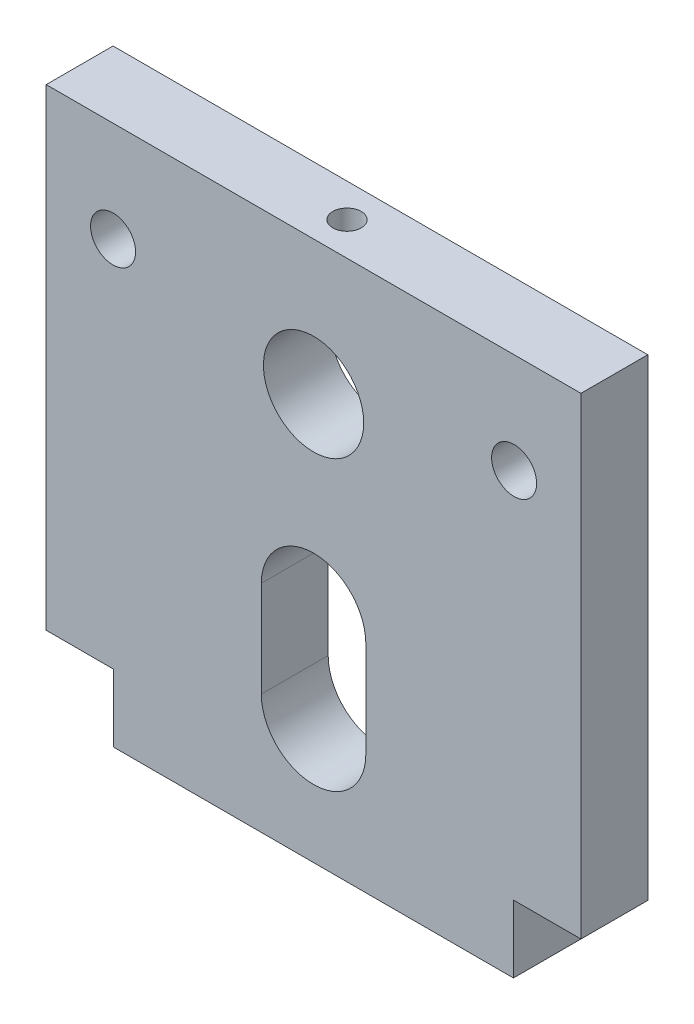
ISO-10303-21;
HEADER;
FILE_DESCRIPTION(('STEP AP214'),'2;1');
FILE_NAME('part.step','',(''),(''),'','','');
FILE_SCHEMA(('AUTOMOTIVE_DESIGN { 1 0 10303 214 1 1 1 1 }'));
ENDSEC;
DATA;
#1=APPLICATION_CONTEXT('core data for automotive mechanical design processes');
#2=APPLICATION_PROTOCOL_DEFINITION('international standard','automotive_design',2000,#1);
#3=PRODUCT_CONTEXT('',#1,'mechanical');
#4=PRODUCT('Part','Part','',(#3));
#5=PRODUCT_RELATED_PRODUCT_CATEGORY('part','',(#4));
#6=PRODUCT_DEFINITION_FORMATION('','',#4);
#7=PRODUCT_DEFINITION_CONTEXT('part definition',#1,'design');
#8=PRODUCT_DEFINITION('design','',#6,#7);
#9=PRODUCT_DEFINITION_SHAPE('','',#8);
#10=(LENGTH_UNIT() NAMED_UNIT(*) SI_UNIT(.MILLI.,.METRE.));
#11=(NAMED_UNIT(*) PLANE_ANGLE_UNIT() SI_UNIT($,.RADIAN.));
#12=(NAMED_UNIT(*) SI_UNIT($,.STERADIAN.) SOLID_ANGLE_UNIT());
#13=UNCERTAINTY_MEASURE_WITH_UNIT(LENGTH_MEASURE(1.E-05),#10,'distance_accuracy_value','');
#14=(GEOMETRIC_REPRESENTATION_CONTEXT(3) GLOBAL_UNCERTAINTY_ASSIGNED_CONTEXT((#13)) GLOBAL_UNIT_ASSIGNED_CONTEXT((#10,
#11,#12)) REPRESENTATION_CONTEXT('',''));
#15=CARTESIAN_POINT('',(0.,0.,0.));
#16=DIRECTION('',(0.,0.,1.));
#17=DIRECTION('',(1.,0.,0.));
#18=AXIS2_PLACEMENT_3D('',#15,#16,#17);
#19=CARTESIAN_POINT('',(0.,0.,6.35));
#20=DIRECTION('',(0.,0.,-1.));
#21=DIRECTION('',(-1.,0.,0.));
#22=AXIS2_PLACEMENT_3D('',#19,#20,#21);
#23=PLANE('',#22);
#24=DIRECTION('',(1.,0.,0.));
#25=VECTOR('',#24,1.);
#26=CARTESIAN_POINT('',(-25.6832529056942,38.8666430110286,6.35));
#27=LINE('',#26,#25);
#28=CARTESIAN_POINT('',(-25.6832529056942,38.8666430110286,6.35));
#29=VERTEX_POINT('',#28);
#30=CARTESIAN_POINT('',(25.1167470943058,38.8666430110286,6.35));
#31=VERTEX_POINT('',#30);
#32=EDGE_CURVE('E191',#29,#31,#27,.T.);
#33=ORIENTED_EDGE('',*,*,#32,.F.);
#34=DIRECTION('',(0.,1.,0.));
#35=VECTOR('',#34,1.);
#36=CARTESIAN_POINT('',(-25.6832529056942,-6.02785698897139,6.35));
#37=LINE('',#36,#35);
#38=CARTESIAN_POINT('',(-25.6832529056942,-6.02785698897139,6.35));
#39=VERTEX_POINT('',#38);
#40=EDGE_CURVE('E214',#39,#29,#37,.T.);
#41=ORIENTED_EDGE('',*,*,#40,.F.);
#42=DIRECTION('',(-1.,0.,0.));
#43=VECTOR('',#42,1.);
#44=CARTESIAN_POINT('',(-19.2697529056942,-6.02785698897138,6.35));
#45=LINE('',#44,#43);
#46=CARTESIAN_POINT('',(-19.2697529056942,-6.02785698897138,6.35));
#47=VERTEX_POINT('',#46);
#48=EDGE_CURVE('E215',#47,#39,#45,.T.);
#49=ORIENTED_EDGE('',*,*,#48,.F.);
#50=DIRECTION('',(0.,1.,0.));
#51=VECTOR('',#50,1.);
#52=CARTESIAN_POINT('',(-19.2697529056942,-12.4413569889714,6.35));
#53=LINE('',#52,#51);
#54=CARTESIAN_POINT('',(-19.2697529056942,-12.4413569889714,6.35));
#55=VERTEX_POINT('',#54);
#56=EDGE_CURVE('E207',#55,#47,#53,.T.);
#57=ORIENTED_EDGE('',*,*,#56,.F.);
#58=DIRECTION('',(-1.,0.,0.));
#59=VECTOR('',#58,1.);
#60=CARTESIAN_POINT('',(18.7032470943058,-12.4413569889714,6.35));
#61=LINE('',#60,#59);
#62=CARTESIAN_POINT('',(18.7032470943058,-12.4413569889714,6.35));
#63=VERTEX_POINT('',#62);
#64=EDGE_CURVE('E206',#63,#55,#61,.T.);
#65=ORIENTED_EDGE('',*,*,#64,.F.);
#66=DIRECTION('',(0.,-1.,0.));
#67=VECTOR('',#66,1.);
#68=CARTESIAN_POINT('',(18.7032470943058,-6.02785698897138,6.35));
#69=LINE('',#68,#67);
#70=CARTESIAN_POINT('',(18.7032470943058,-6.02785698897138,6.35));
#71=VERTEX_POINT('',#70);
#72=EDGE_CURVE('E201',#71,#63,#69,.T.);
#73=ORIENTED_EDGE('',*,*,#72,.F.);
#74=DIRECTION('',(-1.,0.,0.));
#75=VECTOR('',#74,1.);
#76=CARTESIAN_POINT('',(25.1167470943058,-6.02785698897138,6.35));
#77=LINE('',#76,#75);
#78=CARTESIAN_POINT('',(25.1167470943058,-6.02785698897138,6.35));
#79=VERTEX_POINT('',#78);
#80=EDGE_CURVE('E199',#79,#71,#77,.T.);
#81=ORIENTED_EDGE('',*,*,#80,.F.);
#82=DIRECTION('',(0.,-1.,0.));
#83=VECTOR('',#82,1.);
#84=CARTESIAN_POINT('',(25.1167470943058,38.8666430110286,6.35));
#85=LINE('',#84,#83);
#86=EDGE_CURVE('E198',#31,#79,#85,.T.);
#87=ORIENTED_EDGE('',*,*,#86,.F.);
#88=EDGE_LOOP('',(#33,#41,#49,#57,#65,#73,#81,#87));
#89=FACE_BOUND('',#88,.T.);
#90=CARTESIAN_POINT('',(-0.283252905694163,26.1031430110286,6.35));
#91=DIRECTION('',(0.,0.,1.));
#92=DIRECTION('',(1.,0.,0.));
#93=AXIS2_PLACEMENT_3D('',#90,#91,#92);
#94=CIRCLE('',#93,4.7625);
#95=CARTESIAN_POINT('',(4.47924709430584,26.1031430110286,6.35));
#96=VERTEX_POINT('',#95);
#97=EDGE_CURVE('E176',#96,#96,#94,.T.);
#98=ORIENTED_EDGE('',*,*,#97,.F.);
#99=EDGE_LOOP('',(#98));
#100=FACE_BOUND('',#99,.T.);
#101=CARTESIAN_POINT('',(18.7667470943058,29.3416430110286,6.35));
#102=DIRECTION('',(0.,0.,1.));
#103=DIRECTION('',(1.,0.,0.));
#104=AXIS2_PLACEMENT_3D('',#101,#102,#103);
#105=CIRCLE('',#104,2.13995);
#106=CARTESIAN_POINT('',(20.9066970943058,29.3416430110286,6.35));
#107=VERTEX_POINT('',#106);
#108=EDGE_CURVE('E185',#107,#107,#105,.T.);
#109=ORIENTED_EDGE('',*,*,#108,.F.);
#110=EDGE_LOOP('',(#109));
#111=FACE_BOUND('',#110,.T.);
#112=CARTESIAN_POINT('',(-19.3332529056942,29.3416430110286,6.35));
#113=DIRECTION('',(0.,0.,1.));
#114=DIRECTION('',(1.,0.,0.));
#115=AXIS2_PLACEMENT_3D('',#112,#113,#114);
#116=CIRCLE('',#115,2.13995);
#117=CARTESIAN_POINT('',(-17.1933029056942,29.3416430110286,6.35));
#118=VERTEX_POINT('',#117);
#119=EDGE_CURVE('E177',#118,#118,#116,.T.);
#120=ORIENTED_EDGE('',*,*,#119,.F.);
#121=EDGE_LOOP('',(#120));
#122=FACE_BOUND('',#121,.T.);
#123=DIRECTION('',(0.,-1.,0.));
#124=VECTOR('',#123,1.);
#125=CARTESIAN_POINT('',(4.67979741050235,8.06066108189071,6.35));
#126=LINE('',#125,#124);
#127=CARTESIAN_POINT('',(4.67979741050235,8.06066108189071,6.35));
#128=VERTEX_POINT('',#127);
#129=CARTESIAN_POINT('',(4.67979741050235,-1.05833895885947,6.35));
#130=VERTEX_POINT('',#129);
#131=EDGE_CURVE('E65',#128,#130,#126,.T.);
#132=ORIENTED_EDGE('',*,*,#131,.T.);
#133=CARTESIAN_POINT('',(-0.283252905694165,-1.05833895885947,6.35));
#134=DIRECTION('',(0.,0.,1.));
#135=DIRECTION('',(1.,0.,0.));
#136=AXIS2_PLACEMENT_3D('',#133,#134,#135);
#137=CIRCLE('',#136,4.96305031619651);
#138=CARTESIAN_POINT('',(-5.24630322189068,-1.05833895885947,6.35));
#139=VERTEX_POINT('',#138);
#140=EDGE_CURVE('E155',#139,#130,#137,.T.);
#141=ORIENTED_EDGE('',*,*,#140,.F.);
#142=DIRECTION('',(0.,-1.,0.));
#143=VECTOR('',#142,1.);
#144=CARTESIAN_POINT('',(-5.24630322189068,8.06066108189071,6.35));
#145=LINE('',#144,#143);
#146=CARTESIAN_POINT('',(-5.24630322189068,8.06066108189071,6.35));
#147=VERTEX_POINT('',#146);
#148=EDGE_CURVE('E167',#147,#139,#145,.T.);
#149=ORIENTED_EDGE('',*,*,#148,.F.);
#150=CARTESIAN_POINT('',(-0.283252905694165,8.06066108189071,6.35));
#151=DIRECTION('',(0.,0.,1.));
#152=DIRECTION('',(1.,0.,0.));
#153=AXIS2_PLACEMENT_3D('',#150,#151,#152);
#154=CIRCLE('',#153,4.96305031619651);
#155=EDGE_CURVE('E148',#128,#147,#154,.T.);
#156=ORIENTED_EDGE('',*,*,#155,.F.);
#157=EDGE_LOOP('',(#132,#141,#149,#156));
#158=FACE_BOUND('',#157,.T.);
#159=ADVANCED_FACE('F50',(#89,#100,#111,#122,#158),#23,.F.);
#160=CARTESIAN_POINT('',(0.,0.,0.));
#161=DIRECTION('',(0.,0.,-1.));
#162=DIRECTION('',(-1.,0.,0.));
#163=AXIS2_PLACEMENT_3D('',#160,#161,#162);
#164=PLANE('',#163);
#165=CARTESIAN_POINT('',(-19.3332529056942,29.3416430110286,0.));
#166=DIRECTION('',(0.,0.,1.));
#167=DIRECTION('',(1.,0.,0.));
#168=AXIS2_PLACEMENT_3D('',#165,#166,#167);
#169=CIRCLE('',#168,2.13995);
#170=CARTESIAN_POINT('',(-17.1933029056942,29.3416430110286,0.));
#171=VERTEX_POINT('',#170);
#172=EDGE_CURVE('E171',#171,#171,#169,.T.);
#173=ORIENTED_EDGE('',*,*,#172,.T.);
#174=EDGE_LOOP('',(#173));
#175=FACE_BOUND('',#174,.T.);
#176=CARTESIAN_POINT('',(18.7667470943058,29.3416430110286,0.));
#177=DIRECTION('',(0.,0.,1.));
#178=DIRECTION('',(1.,0.,0.));
#179=AXIS2_PLACEMENT_3D('',#176,#177,#178);
#180=CIRCLE('',#179,2.13995);
#181=CARTESIAN_POINT('',(20.9066970943058,29.3416430110286,0.));
#182=VERTEX_POINT('',#181);
#183=EDGE_CURVE('E153',#182,#182,#180,.T.);
#184=ORIENTED_EDGE('',*,*,#183,.T.);
#185=EDGE_LOOP('',(#184));
#186=FACE_BOUND('',#185,.T.);
#187=CARTESIAN_POINT('',(-0.283252905694163,26.1031430110286,0.));
#188=DIRECTION('',(0.,0.,1.));
#189=DIRECTION('',(1.,0.,0.));
#190=AXIS2_PLACEMENT_3D('',#187,#188,#189);
#191=CIRCLE('',#190,4.7625);
#192=CARTESIAN_POINT('',(4.47924709430584,26.1031430110286,0.));
#193=VERTEX_POINT('',#192);
#194=EDGE_CURVE('E189',#193,#193,#191,.T.);
#195=ORIENTED_EDGE('',*,*,#194,.T.);
#196=EDGE_LOOP('',(#195));
#197=FACE_BOUND('',#196,.T.);
#198=DIRECTION('',(1.,0.,0.));
#199=VECTOR('',#198,1.);
#200=CARTESIAN_POINT('',(-25.6832529056942,38.8666430110286,0.));
#201=LINE('',#200,#199);
#202=CARTESIAN_POINT('',(-25.6832529056942,38.8666430110286,0.));
#203=VERTEX_POINT('',#202);
#204=CARTESIAN_POINT('',(25.1167470943058,38.8666430110286,0.));
#205=VERTEX_POINT('',#204);
#206=EDGE_CURVE('E186',#203,#205,#201,.T.);
#207=ORIENTED_EDGE('',*,*,#206,.T.);
#208=DIRECTION('',(0.,-1.,0.));
#209=VECTOR('',#208,1.);
#210=CARTESIAN_POINT('',(25.1167470943058,38.8666430110286,0.));
#211=LINE('',#210,#209);
#212=CARTESIAN_POINT('',(25.1167470943058,-6.02785698897138,0.));
#213=VERTEX_POINT('',#212);
#214=EDGE_CURVE('E219',#205,#213,#211,.T.);
#215=ORIENTED_EDGE('',*,*,#214,.T.);
#216=DIRECTION('',(-1.,0.,0.));
#217=VECTOR('',#216,1.);
#218=CARTESIAN_POINT('',(25.1167470943058,-6.02785698897138,0.));
#219=LINE('',#218,#217);
#220=CARTESIAN_POINT('',(18.7032470943058,-6.02785698897138,0.));
#221=VERTEX_POINT('',#220);
#222=EDGE_CURVE('E224',#213,#221,#219,.T.);
#223=ORIENTED_EDGE('',*,*,#222,.T.);
#224=DIRECTION('',(0.,-1.,0.));
#225=VECTOR('',#224,1.);
#226=CARTESIAN_POINT('',(18.7032470943058,-6.02785698897138,0.));
#227=LINE('',#226,#225);
#228=CARTESIAN_POINT('',(18.7032470943058,-12.4413569889714,0.));
#229=VERTEX_POINT('',#228);
#230=EDGE_CURVE('E228',#221,#229,#227,.T.);
#231=ORIENTED_EDGE('',*,*,#230,.T.);
#232=DIRECTION('',(-1.,0.,0.));
#233=VECTOR('',#232,1.);
#234=CARTESIAN_POINT('',(18.7032470943058,-12.4413569889714,0.));
#235=LINE('',#234,#233);
#236=CARTESIAN_POINT('',(-19.2697529056942,-12.4413569889714,0.));
#237=VERTEX_POINT('',#236);
#238=EDGE_CURVE('E230',#229,#237,#235,.T.);
#239=ORIENTED_EDGE('',*,*,#238,.T.);
#240=DIRECTION('',(0.,1.,0.));
#241=VECTOR('',#240,1.);
#242=CARTESIAN_POINT('',(-19.2697529056942,-12.4413569889714,0.));
#243=LINE('',#242,#241);
#244=CARTESIAN_POINT('',(-19.2697529056942,-6.02785698897138,0.));
#245=VERTEX_POINT('',#244);
#246=EDGE_CURVE('E235',#237,#245,#243,.T.);
#247=ORIENTED_EDGE('',*,*,#246,.T.);
#248=DIRECTION('',(-1.,0.,0.));
#249=VECTOR('',#248,1.);
#250=CARTESIAN_POINT('',(-19.2697529056942,-6.02785698897138,0.));
#251=LINE('',#250,#249);
#252=CARTESIAN_POINT('',(-25.6832529056942,-6.02785698897139,0.));
#253=VERTEX_POINT('',#252);
#254=EDGE_CURVE('E234',#245,#253,#251,.T.);
#255=ORIENTED_EDGE('',*,*,#254,.T.);
#256=DIRECTION('',(0.,1.,0.));
#257=VECTOR('',#256,1.);
#258=CARTESIAN_POINT('',(-25.6832529056942,-6.02785698897139,0.));
#259=LINE('',#258,#257);
#260=EDGE_CURVE('E197',#253,#203,#259,.T.);
#261=ORIENTED_EDGE('',*,*,#260,.T.);
#262=EDGE_LOOP('',(#207,#215,#223,#231,#239,#247,#255,#261));
#263=FACE_BOUND('',#262,.T.);
#264=CARTESIAN_POINT('',(-0.283252905694165,-1.05833895885947,0.));
#265=DIRECTION('',(0.,0.,1.));
#266=DIRECTION('',(1.,0.,0.));
#267=AXIS2_PLACEMENT_3D('',#264,#265,#266);
#268=CIRCLE('',#267,4.96305031619651);
#269=CARTESIAN_POINT('',(-5.24630322189068,-1.05833895885947,0.));
#270=VERTEX_POINT('',#269);
#271=CARTESIAN_POINT('',(4.67979741050235,-1.05833895885947,0.));
#272=VERTEX_POINT('',#271);
#273=EDGE_CURVE('E144',#270,#272,#268,.T.);
#274=ORIENTED_EDGE('',*,*,#273,.T.);
#275=DIRECTION('',(0.,-1.,0.));
#276=VECTOR('',#275,1.);
#277=CARTESIAN_POINT('',(4.67979741050235,8.06066108189071,0.));
#278=LINE('',#277,#276);
#279=CARTESIAN_POINT('',(4.67979741050235,8.06066108189071,0.));
#280=VERTEX_POINT('',#279);
#281=EDGE_CURVE('E131',#280,#272,#278,.T.);
#282=ORIENTED_EDGE('',*,*,#281,.F.);
#283=CARTESIAN_POINT('',(-0.283252905694165,8.06066108189071,0.));
#284=DIRECTION('',(0.,0.,1.));
#285=DIRECTION('',(1.,0.,0.));
#286=AXIS2_PLACEMENT_3D('',#283,#284,#285);
#287=CIRCLE('',#286,4.96305031619651);
#288=CARTESIAN_POINT('',(-5.24630322189068,8.06066108189071,0.));
#289=VERTEX_POINT('',#288);
#290=EDGE_CURVE('E158',#280,#289,#287,.T.);
#291=ORIENTED_EDGE('',*,*,#290,.T.);
#292=DIRECTION('',(0.,-1.,0.));
#293=VECTOR('',#292,1.);
#294=CARTESIAN_POINT('',(-5.24630322189068,8.06066108189071,0.));
#295=LINE('',#294,#293);
#296=EDGE_CURVE('E75',#289,#270,#295,.T.);
#297=ORIENTED_EDGE('',*,*,#296,.T.);
#298=EDGE_LOOP('',(#274,#282,#291,#297));
#299=FACE_BOUND('',#298,.T.);
#300=ADVANCED_FACE('F156',(#175,#186,#197,#263,#299),#164,.T.);
#301=CARTESIAN_POINT('',(-25.6832529056942,38.8666430110286,6.35));
#302=DIRECTION('',(0.,1.,0.));
#303=DIRECTION('',(0.,0.,1.));
#304=AXIS2_PLACEMENT_3D('',#301,#302,#303);
#305=PLANE('',#304);
#306=CARTESIAN_POINT('',(-0.283252905694174,38.8666430110286,3.175));
#307=DIRECTION('',(0.,1.,0.));
#308=DIRECTION('',(0.,0.,1.));
#309=AXIS2_PLACEMENT_3D('',#306,#307,#308);
#310=CIRCLE('',#309,1.35255);
#311=CARTESIAN_POINT('',(-0.283252905694174,38.8666430110286,4.52755));
#312=VERTEX_POINT('',#311);
#313=EDGE_CURVE('E332',#312,#312,#310,.T.);
#314=ORIENTED_EDGE('',*,*,#313,.F.);
#315=EDGE_LOOP('',(#314));
#316=FACE_BOUND('',#315,.T.);
#317=ORIENTED_EDGE('',*,*,#206,.F.);
#318=DIRECTION('',(0.,0.,-1.));
#319=VECTOR('',#318,1.);
#320=CARTESIAN_POINT('',(-25.6832529056942,38.8666430110286,6.35));
#321=LINE('',#320,#319);
#322=EDGE_CURVE('E11',#29,#203,#321,.T.);
#323=ORIENTED_EDGE('',*,*,#322,.F.);
#324=ORIENTED_EDGE('',*,*,#32,.T.);
#325=DIRECTION('',(0.,0.,-1.));
#326=VECTOR('',#325,1.);
#327=CARTESIAN_POINT('',(25.1167470943058,38.8666430110286,6.35));
#328=LINE('',#327,#326);
#329=EDGE_CURVE('E51',#31,#205,#328,.T.);
#330=ORIENTED_EDGE('',*,*,#329,.T.);
#331=EDGE_LOOP('',(#317,#323,#324,#330));
#332=FACE_BOUND('',#331,.T.);
#333=ADVANCED_FACE('F47',(#316,#332),#305,.T.);
#334=CARTESIAN_POINT('',(-25.6832529056942,-6.02785698897139,6.35));
#335=DIRECTION('',(-1.,0.,0.));
#336=DIRECTION('',(0.,-1.,0.));
#337=AXIS2_PLACEMENT_3D('',#334,#335,#336);
#338=PLANE('',#337);
#339=ORIENTED_EDGE('',*,*,#260,.F.);
#340=DIRECTION('',(0.,0.,-1.));
#341=VECTOR('',#340,1.);
#342=CARTESIAN_POINT('',(-25.6832529056942,-6.02785698897139,6.35));
#343=LINE('',#342,#341);
#344=EDGE_CURVE('E57',#39,#253,#343,.T.);
#345=ORIENTED_EDGE('',*,*,#344,.F.);
#346=ORIENTED_EDGE('',*,*,#40,.T.);
#347=ORIENTED_EDGE('',*,*,#322,.T.);
#348=EDGE_LOOP('',(#339,#345,#346,#347));
#349=FACE_BOUND('',#348,.T.);
#350=ADVANCED_FACE('F261',(#349),#338,.T.);
#351=CARTESIAN_POINT('',(-19.2697529056942,-6.02785698897138,6.35));
#352=DIRECTION('',(0.,-1.,0.));
#353=DIRECTION('',(1.,0.,0.));
#354=AXIS2_PLACEMENT_3D('',#351,#352,#353);
#355=PLANE('',#354);
#356=ORIENTED_EDGE('',*,*,#254,.F.);
#357=DIRECTION('',(0.,0.,-1.));
#358=VECTOR('',#357,1.);
#359=CARTESIAN_POINT('',(-19.2697529056942,-6.02785698897138,6.35));
#360=LINE('',#359,#358);
#361=EDGE_CURVE('E243',#47,#245,#360,.T.);
#362=ORIENTED_EDGE('',*,*,#361,.F.);
#363=ORIENTED_EDGE('',*,*,#48,.T.);
#364=ORIENTED_EDGE('',*,*,#344,.T.);
#365=EDGE_LOOP('',(#356,#362,#363,#364));
#366=FACE_BOUND('',#365,.T.);
#367=ADVANCED_FACE('F284',(#366),#355,.T.);
#368=CARTESIAN_POINT('',(-19.2697529056942,-12.4413569889714,6.35));
#369=DIRECTION('',(-1.,0.,0.));
#370=DIRECTION('',(0.,-1.,0.));
#371=AXIS2_PLACEMENT_3D('',#368,#369,#370);
#372=PLANE('',#371);
#373=ORIENTED_EDGE('',*,*,#246,.F.);
#374=DIRECTION('',(0.,0.,-1.));
#375=VECTOR('',#374,1.);
#376=CARTESIAN_POINT('',(-19.2697529056942,-12.4413569889714,6.35));
#377=LINE('',#376,#375);
#378=EDGE_CURVE('E242',#55,#237,#377,.T.);
#379=ORIENTED_EDGE('',*,*,#378,.F.);
#380=ORIENTED_EDGE('',*,*,#56,.T.);
#381=ORIENTED_EDGE('',*,*,#361,.T.);
#382=EDGE_LOOP('',(#373,#379,#380,#381));
#383=FACE_BOUND('',#382,.T.);
#384=ADVANCED_FACE('F278',(#383),#372,.T.);
#385=CARTESIAN_POINT('',(18.7032470943058,-12.4413569889714,6.35));
#386=DIRECTION('',(0.,-1.,0.));
#387=DIRECTION('',(1.,0.,0.));
#388=AXIS2_PLACEMENT_3D('',#385,#386,#387);
#389=PLANE('',#388);
#390=ORIENTED_EDGE('',*,*,#238,.F.);
#391=DIRECTION('',(0.,0.,-1.));
#392=VECTOR('',#391,1.);
#393=CARTESIAN_POINT('',(18.7032470943058,-12.4413569889714,6.35));
#394=LINE('',#393,#392);
#395=EDGE_CURVE('E241',#63,#229,#394,.T.);
#396=ORIENTED_EDGE('',*,*,#395,.F.);
#397=ORIENTED_EDGE('',*,*,#64,.T.);
#398=ORIENTED_EDGE('',*,*,#378,.T.);
#399=EDGE_LOOP('',(#390,#396,#397,#398));
#400=FACE_BOUND('',#399,.T.);
#401=ADVANCED_FACE('F277',(#400),#389,.T.);
#402=CARTESIAN_POINT('',(18.7032470943058,-6.02785698897138,6.35));
#403=DIRECTION('',(1.,0.,0.));
#404=DIRECTION('',(0.,1.,0.));
#405=AXIS2_PLACEMENT_3D('',#402,#403,#404);
#406=PLANE('',#405);
#407=ORIENTED_EDGE('',*,*,#230,.F.);
#408=DIRECTION('',(0.,0.,-1.));
#409=VECTOR('',#408,1.);
#410=CARTESIAN_POINT('',(18.7032470943058,-6.02785698897138,6.35));
#411=LINE('',#410,#409);
#412=EDGE_CURVE('E250',#71,#221,#411,.T.);
#413=ORIENTED_EDGE('',*,*,#412,.F.);
#414=ORIENTED_EDGE('',*,*,#72,.T.);
#415=ORIENTED_EDGE('',*,*,#395,.T.);
#416=EDGE_LOOP('',(#407,#413,#414,#415));
#417=FACE_BOUND('',#416,.T.);
#418=ADVANCED_FACE('F273',(#417),#406,.T.);
#419=CARTESIAN_POINT('',(25.1167470943058,-6.02785698897138,6.35));
#420=DIRECTION('',(0.,-1.,0.));
#421=DIRECTION('',(1.,0.,0.));
#422=AXIS2_PLACEMENT_3D('',#419,#420,#421);
#423=PLANE('',#422);
#424=ORIENTED_EDGE('',*,*,#222,.F.);
#425=DIRECTION('',(0.,0.,-1.));
#426=VECTOR('',#425,1.);
#427=CARTESIAN_POINT('',(25.1167470943058,-6.02785698897138,6.35));
#428=LINE('',#427,#426);
#429=EDGE_CURVE('E246',#79,#213,#428,.T.);
#430=ORIENTED_EDGE('',*,*,#429,.F.);
#431=ORIENTED_EDGE('',*,*,#80,.T.);
#432=ORIENTED_EDGE('',*,*,#412,.T.);
#433=EDGE_LOOP('',(#424,#430,#431,#432));
#434=FACE_BOUND('',#433,.T.);
#435=ADVANCED_FACE('F269',(#434),#423,.T.);
#436=CARTESIAN_POINT('',(25.1167470943058,38.8666430110286,6.35));
#437=DIRECTION('',(1.,0.,0.));
#438=DIRECTION('',(0.,1.,0.));
#439=AXIS2_PLACEMENT_3D('',#436,#437,#438);
#440=PLANE('',#439);
#441=ORIENTED_EDGE('',*,*,#214,.F.);
#442=ORIENTED_EDGE('',*,*,#329,.F.);
#443=ORIENTED_EDGE('',*,*,#86,.T.);
#444=ORIENTED_EDGE('',*,*,#429,.T.);
#445=EDGE_LOOP('',(#441,#442,#443,#444));
#446=FACE_BOUND('',#445,.T.);
#447=ADVANCED_FACE('F258',(#446),#440,.T.);
#448=CARTESIAN_POINT('',(-0.283252905694163,26.1031430110286,0.));
#449=DIRECTION('',(0.,0.,1.));
#450=DIRECTION('',(1.,0.,0.));
#451=AXIS2_PLACEMENT_3D('',#448,#449,#450);
#452=CYLINDRICAL_SURFACE('',#451,4.7625);
#453=CARTESIAN_POINT('',(-0.283252905694174,30.8656430110286,4.52755));
#454=CARTESIAN_POINT('',(-0.208874405736026,30.8656421015908,4.5275486430201));
#455=CARTESIAN_POINT('',(-0.134481908330508,30.863883695177,4.52139427786597));
#456=CARTESIAN_POINT('',(0.0121481427492365,30.8570403231636,4.49699047829311));
#457=CARTESIAN_POINT('',(0.0843848492039293,30.851954067271,4.47873635244937));
#458=CARTESIAN_POINT('',(0.224566466768027,30.8390143330927,4.43078329715905));
#459=CARTESIAN_POINT('',(0.292517169479274,30.8311646876722,4.40110021454008));
#460=CARTESIAN_POINT('',(0.422476658401505,30.8135207578096,4.33119378181307));
#461=CARTESIAN_POINT('',(0.484484842391155,30.8037262765841,4.29096936497405));
#462=CARTESIAN_POINT('',(0.602411605554832,30.7829588881212,4.20001870977713));
#463=CARTESIAN_POINT('',(0.658153709045761,30.7719637667209,4.14906872941423));
#464=CARTESIAN_POINT('',(0.760428283368972,30.7501717288703,4.03859076612216));
#465=CARTESIAN_POINT('',(0.806959392203056,30.7393748419459,3.97906151685142));
#466=CARTESIAN_POINT('',(0.890385838075102,30.7189706483605,3.85166351744424));
#467=CARTESIAN_POINT('',(0.927071910302048,30.709391161236,3.78365286087309));
#468=CARTESIAN_POINT('',(0.988416582063241,30.692835774221,3.64211211694877));
#469=CARTESIAN_POINT('',(1.01307773429582,30.6858593218219,3.56858320486075));
#470=CARTESIAN_POINT('',(1.04904771634093,30.6755303446948,3.42006189795207));
#471=CARTESIAN_POINT('',(1.06067929792737,30.6720904046822,3.34515390446938));
#472=CARTESIAN_POINT('',(1.07126705848638,30.6689633154032,3.1943768560357));
#473=CARTESIAN_POINT('',(1.07022595527154,30.6692753614771,3.11850801063768));
#474=CARTESIAN_POINT('',(1.05575274236854,30.6735391329063,2.97053442802031));
#475=CARTESIAN_POINT('',(1.04271802353279,30.6773741240544,2.89838691263082));
#476=CARTESIAN_POINT('',(1.005266881567,30.6880637858551,2.75734778962324));
#477=CARTESIAN_POINT('',(0.980849440525733,30.6949187265667,2.688456473801));
#478=CARTESIAN_POINT('',(0.921018110199574,30.7109736980892,2.55488196332034));
#479=CARTESIAN_POINT('',(0.885470231874481,30.7202020444125,2.49026233362383));
#480=CARTESIAN_POINT('',(0.804480374330773,30.739949625836,2.36776901838411));
#481=CARTESIAN_POINT('',(0.759036215692947,30.7504691450632,2.30989682311937));
#482=CARTESIAN_POINT('',(0.657541351273729,30.7720934119198,2.20027881637208));
#483=CARTESIAN_POINT('',(0.601158870924395,30.7832053700219,2.14884113440109));
#484=CARTESIAN_POINT('',(0.480430601140097,30.8044135496946,2.056083587976));
#485=CARTESIAN_POINT('',(0.416084409021523,30.8145097198553,2.01476423546827));
#486=CARTESIAN_POINT('',(0.280736315681626,30.8326253706565,1.94325494809201));
#487=CARTESIAN_POINT('',(0.209699932562487,30.8406331895481,1.91312712835502));
#488=CARTESIAN_POINT('',(0.0632896696307047,30.8535858242615,1.86533374841148));
#489=CARTESIAN_POINT('',(-0.0120831253918858,30.8585314025188,1.8476650859767));
#490=CARTESIAN_POINT('',(-0.162402208789636,30.8646843257905,1.8257900941737));
#491=CARTESIAN_POINT('',(-0.237282974890373,30.866007764691,1.82116553193465));
#492=CARTESIAN_POINT('',(-0.386752472094515,30.8651045204259,1.82434628148552));
#493=CARTESIAN_POINT('',(-0.461341236734929,30.862878257703,1.8321501211997));
#494=CARTESIAN_POINT('',(-0.60657323886549,30.8552012995763,1.85962538244712));
#495=CARTESIAN_POINT('',(-0.677265426245001,30.8498155565651,1.8790578995256));
#496=CARTESIAN_POINT('',(-0.814375401586083,30.8364361934415,1.92895641763358));
#497=CARTESIAN_POINT('',(-0.880792696760375,30.8284422733143,1.95942368801874));
#498=CARTESIAN_POINT('',(-1.00904917584107,30.8104684486735,2.03126494247286));
#499=CARTESIAN_POINT('',(-1.07075948415866,30.8004495970872,2.07285900781803));
#500=CARTESIAN_POINT('',(-1.18646918295864,30.7795806730468,2.16550128896996));
#501=CARTESIAN_POINT('',(-1.2404668357056,30.768730414112,2.21655162943405));
#502=CARTESIAN_POINT('',(-1.34102181537657,30.7469848128855,2.32861713337727));
#503=CARTESIAN_POINT('',(-1.38728260674078,30.736099327037,2.38990082578654));
#504=CARTESIAN_POINT('',(-1.46887734196172,30.7158942900598,2.51959581025901));
#505=CARTESIAN_POINT('',(-1.50421167494599,30.7065746831704,2.58800684837768));
#506=CARTESIAN_POINT('',(-1.5626915554602,30.6906654628349,2.72972431512764));
#507=CARTESIAN_POINT('',(-1.58590242939607,30.6840612595326,2.80300205720859));
#508=CARTESIAN_POINT('',(-1.61960122640761,30.6743455771231,2.95264418491539));
#509=CARTESIAN_POINT('',(-1.63009294717261,30.6712330554891,3.02900764216698));
#510=CARTESIAN_POINT('',(-1.63781639938448,30.6689483068662,3.17959566461426));
#511=CARTESIAN_POINT('',(-1.63552802559694,30.6696334687527,3.25379379693445));
#512=CARTESIAN_POINT('',(-1.61888582236865,30.674528423122,3.40069987613526));
#513=CARTESIAN_POINT('',(-1.60453238655974,30.6787381006148,3.47340787155346));
#514=CARTESIAN_POINT('',(-1.56446228763825,30.6901172593615,3.61457466494029));
#515=CARTESIAN_POINT('',(-1.53886016398553,30.6972568596062,3.68306855721659));
#516=CARTESIAN_POINT('',(-1.47710802331352,30.7136888015577,3.81484262392983));
#517=CARTESIAN_POINT('',(-1.44095615822818,30.7229815203814,3.87812188239307));
#518=CARTESIAN_POINT('',(-1.35773063181675,30.7430558307057,3.9999291052839));
#519=CARTESIAN_POINT('',(-1.31033571660894,30.7538764561547,4.05823115248443));
#520=CARTESIAN_POINT('',(-1.20656377936464,30.7755844260417,4.1662102271965));
#521=CARTESIAN_POINT('',(-1.15018450652386,30.7864717865395,4.21588508684919));
#522=CARTESIAN_POINT('',(-1.02832800896819,30.8074157125441,4.30644175885675));
#523=CARTESIAN_POINT('',(-0.962657022380482,30.8174443626607,4.34706990505124));
#524=CARTESIAN_POINT('',(-0.825132154228833,30.8352214929742,4.41664775838159));
#525=CARTESIAN_POINT('',(-0.753281733986893,30.8429712390535,4.44560395236433));
#526=CARTESIAN_POINT('',(-0.615435359077656,30.8544780413436,4.48782989682263));
#527=CARTESIAN_POINT('',(-0.549954950188781,30.8586323687404,4.50268750874605));
#528=CARTESIAN_POINT('',(-0.417404319195111,30.8642150861984,4.52254753056349));
#529=CARTESIAN_POINT('',(-0.350334305275061,30.8656438312436,4.52755122384977));
#530=CARTESIAN_POINT('',(-0.283252905694174,30.8656430110286,4.52755));
#531=B_SPLINE_CURVE_WITH_KNOTS('',3,(#453,#454,#455,#456,#457,#458,#459,#460,#461,#462,#463,
#464,#465,#466,#467,#468,#469,#470,#471,#472,#473,#474,#475,#476,#477,#478,#479,#480,#481,#482,
#483,#484,#485,#486,#487,#488,#489,#490,#491,#492,#493,#494,#495,#496,#497,#498,#499,#500,#501,
#502,#503,#504,#505,#506,#507,#508,#509,#510,#511,#512,#513,#514,#515,#516,#517,#518,#519,#520,
#521,#522,#523,#524,#525,#526,#527,#528,#529,#530),.UNSPECIFIED.,.T.,.F.,(4,2,2,2,2,2,2,2,2,2,2,
2,2,2,2,2,2,2,2,2,2,2,2,2,2,2,2,2,2,2,2,2,2,2,2,2,2,2,4),(0.,0.222889294304383,
0.445865059785244,0.66853276499121,0.891223011776168,1.11912484754546,1.34706035724664,
1.5795136457763,1.81191756668119,2.03842777803386,2.26488941235131,2.48410768184065,
2.70334555890311,2.92533126990746,3.14736591748721,3.3776632797834,3.6079722917843,
3.83954111207457,4.07105225324437,4.29505113405517,4.51902348540567,4.73854523915272,
4.95809225306818,5.18235198880407,5.40666217297807,5.63821506829868,5.86975971630009,
6.10004348477564,6.33025847809252,6.55188840440896,6.77351110016065,6.99292761660176,
7.21238259274194,7.43908482813347,7.66584394760145,7.89832815072563,8.13068296884128,
8.33173130329812,8.53275345112239),.UNSPECIFIED.);
#532=CARTESIAN_POINT('',(-0.283252905694174,30.8656430110286,4.52755));
#533=VERTEX_POINT('',#532);
#534=EDGE_CURVE('E163',#533,#533,#531,.T.);
#535=ORIENTED_EDGE('',*,*,#534,.T.);
#536=EDGE_LOOP('',(#535));
#537=FACE_BOUND('',#536,.T.);
#538=ORIENTED_EDGE('',*,*,#194,.F.);
#539=EDGE_LOOP('',(#538));
#540=FACE_BOUND('',#539,.T.);
#541=ORIENTED_EDGE('',*,*,#97,.T.);
#542=EDGE_LOOP('',(#541));
#543=FACE_BOUND('',#542,.T.);
#544=ADVANCED_FACE('F296',(#537,#540,#543),#452,.F.);
#545=CARTESIAN_POINT('',(18.7667470943058,29.3416430110286,0.));
#546=DIRECTION('',(0.,0.,1.));
#547=DIRECTION('',(1.,0.,0.));
#548=AXIS2_PLACEMENT_3D('',#545,#546,#547);
#549=CYLINDRICAL_SURFACE('',#548,2.13995);
#550=ORIENTED_EDGE('',*,*,#183,.F.);
#551=EDGE_LOOP('',(#550));
#552=FACE_BOUND('',#551,.T.);
#553=ORIENTED_EDGE('',*,*,#108,.T.);
#554=EDGE_LOOP('',(#553));
#555=FACE_BOUND('',#554,.T.);
#556=ADVANCED_FACE('F301',(#552,#555),#549,.F.);
#557=CARTESIAN_POINT('',(-19.3332529056942,29.3416430110286,0.));
#558=DIRECTION('',(0.,0.,1.));
#559=DIRECTION('',(1.,0.,0.));
#560=AXIS2_PLACEMENT_3D('',#557,#558,#559);
#561=CYLINDRICAL_SURFACE('',#560,2.13995);
#562=ORIENTED_EDGE('',*,*,#172,.F.);
#563=EDGE_LOOP('',(#562));
#564=FACE_BOUND('',#563,.T.);
#565=ORIENTED_EDGE('',*,*,#119,.T.);
#566=EDGE_LOOP('',(#565));
#567=FACE_BOUND('',#566,.T.);
#568=ADVANCED_FACE('F307',(#564,#567),#561,.F.);
#569=CARTESIAN_POINT('',(4.67979741050235,8.06066108189071,0.));
#570=DIRECTION('',(-1.,0.,0.));
#571=DIRECTION('',(0.,0.,1.));
#572=AXIS2_PLACEMENT_3D('',#569,#570,#571);
#573=PLANE('',#572);
#574=ORIENTED_EDGE('',*,*,#131,.F.);
#575=DIRECTION('',(0.,0.,1.));
#576=VECTOR('',#575,1.);
#577=CARTESIAN_POINT('',(4.67979741050235,8.06066108189071,0.));
#578=LINE('',#577,#576);
#579=EDGE_CURVE('E139',#280,#128,#578,.T.);
#580=ORIENTED_EDGE('',*,*,#579,.F.);
#581=ORIENTED_EDGE('',*,*,#281,.T.);
#582=DIRECTION('',(0.,0.,1.));
#583=VECTOR('',#582,1.);
#584=CARTESIAN_POINT('',(4.67979741050235,-1.05833895885947,0.));
#585=LINE('',#584,#583);
#586=EDGE_CURVE('E136',#272,#130,#585,.T.);
#587=ORIENTED_EDGE('',*,*,#586,.T.);
#588=EDGE_LOOP('',(#574,#580,#581,#587));
#589=FACE_BOUND('',#588,.T.);
#590=ADVANCED_FACE('F140',(#589),#573,.T.);
#591=CARTESIAN_POINT('',(-0.283252905694165,-1.05833895885947,0.));
#592=DIRECTION('',(0.,0.,1.));
#593=DIRECTION('',(1.,0.,0.));
#594=AXIS2_PLACEMENT_3D('',#591,#592,#593);
#595=CYLINDRICAL_SURFACE('',#594,4.96305031619651);
#596=ORIENTED_EDGE('',*,*,#140,.T.);
#597=ORIENTED_EDGE('',*,*,#586,.F.);
#598=ORIENTED_EDGE('',*,*,#273,.F.);
#599=DIRECTION('',(0.,0.,1.));
#600=VECTOR('',#599,1.);
#601=CARTESIAN_POINT('',(-5.24630322189068,-1.05833895885947,0.));
#602=LINE('',#601,#600);
#603=EDGE_CURVE('E152',#270,#139,#602,.T.);
#604=ORIENTED_EDGE('',*,*,#603,.T.);
#605=EDGE_LOOP('',(#596,#597,#598,#604));
#606=FACE_BOUND('',#605,.T.);
#607=ADVANCED_FACE('F147',(#606),#595,.F.);
#608=CARTESIAN_POINT('',(-5.24630322189068,8.06066108189071,0.));
#609=DIRECTION('',(-1.,0.,0.));
#610=DIRECTION('',(0.,0.,1.));
#611=AXIS2_PLACEMENT_3D('',#608,#609,#610);
#612=PLANE('',#611);
#613=ORIENTED_EDGE('',*,*,#148,.T.);
#614=ORIENTED_EDGE('',*,*,#603,.F.);
#615=ORIENTED_EDGE('',*,*,#296,.F.);
#616=DIRECTION('',(0.,0.,1.));
#617=VECTOR('',#616,1.);
#618=CARTESIAN_POINT('',(-5.24630322189068,8.06066108189071,0.));
#619=LINE('',#618,#617);
#620=EDGE_CURVE('E174',#289,#147,#619,.T.);
#621=ORIENTED_EDGE('',*,*,#620,.T.);
#622=EDGE_LOOP('',(#613,#614,#615,#621));
#623=FACE_BOUND('',#622,.T.);
#624=ADVANCED_FACE('F312',(#623),#612,.F.);
#625=CARTESIAN_POINT('',(-0.283252905694165,8.06066108189071,0.));
#626=DIRECTION('',(0.,0.,1.));
#627=DIRECTION('',(1.,0.,0.));
#628=AXIS2_PLACEMENT_3D('',#625,#626,#627);
#629=CYLINDRICAL_SURFACE('',#628,4.96305031619651);
#630=ORIENTED_EDGE('',*,*,#155,.T.);
#631=ORIENTED_EDGE('',*,*,#620,.F.);
#632=ORIENTED_EDGE('',*,*,#290,.F.);
#633=ORIENTED_EDGE('',*,*,#579,.T.);
#634=EDGE_LOOP('',(#630,#631,#632,#633));
#635=FACE_BOUND('',#634,.T.);
#636=ADVANCED_FACE('F318',(#635),#629,.F.);
#637=CARTESIAN_POINT('',(-0.283252905694174,38.8666430110286,3.175));
#638=DIRECTION('',(0.,1.,0.));
#639=DIRECTION('',(0.,0.,1.));
#640=AXIS2_PLACEMENT_3D('',#637,#638,#639);
#641=CYLINDRICAL_SURFACE('',#640,1.35255);
#642=ORIENTED_EDGE('',*,*,#534,.F.);
#643=EDGE_LOOP('',(#642));
#644=FACE_BOUND('',#643,.T.);
#645=ORIENTED_EDGE('',*,*,#313,.T.);
#646=EDGE_LOOP('',(#645));
#647=FACE_BOUND('',#646,.T.);
#648=ADVANCED_FACE('F321',(#644,#647),#641,.F.);
#649=CLOSED_SHELL('',(#159,#300,#333,#350,#367,#384,#401,#418,#435,#447,#544,#556,#568,#590,
#607,#624,#636,#648));
#650=MANIFOLD_SOLID_BREP('B2',#649);
#651=ADVANCED_BREP_SHAPE_REPRESENTATION('',(#18,#650),#14);
#652=SHAPE_DEFINITION_REPRESENTATION(#9,#651);
ENDSEC;
END-ISO-10303-21;
